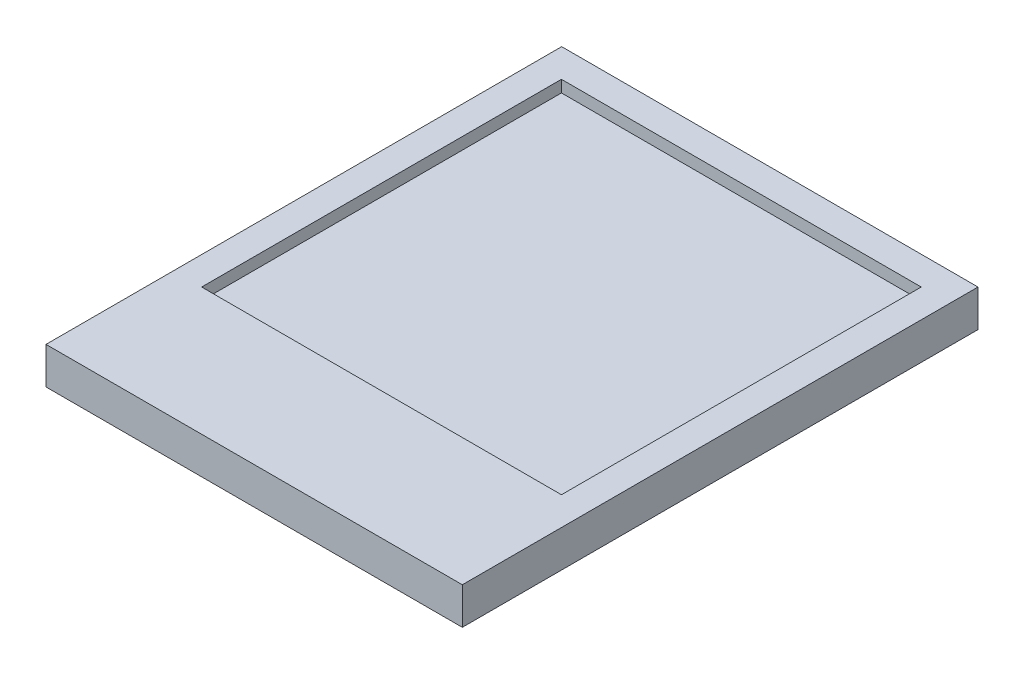
ISO-10303-21;
HEADER;
FILE_DESCRIPTION(('STEP AP214'),'2;1');
FILE_NAME('part.step','',(''),(''),'','','');
FILE_SCHEMA(('AUTOMOTIVE_DESIGN { 1 0 10303 214 1 1 1 1 }'));
ENDSEC;
DATA;
#1=APPLICATION_CONTEXT('core data for automotive mechanical design processes');
#2=APPLICATION_PROTOCOL_DEFINITION('international standard','automotive_design',2000,#1);
#3=PRODUCT_CONTEXT('',#1,'mechanical');
#4=PRODUCT('Part','Part','',(#3));
#5=PRODUCT_RELATED_PRODUCT_CATEGORY('part','',(#4));
#6=PRODUCT_DEFINITION_FORMATION('','',#4);
#7=PRODUCT_DEFINITION_CONTEXT('part definition',#1,'design');
#8=PRODUCT_DEFINITION('design','',#6,#7);
#9=PRODUCT_DEFINITION_SHAPE('','',#8);
#10=(LENGTH_UNIT() NAMED_UNIT(*) SI_UNIT(.MILLI.,.METRE.));
#11=(NAMED_UNIT(*) PLANE_ANGLE_UNIT() SI_UNIT($,.RADIAN.));
#12=(NAMED_UNIT(*) SI_UNIT($,.STERADIAN.) SOLID_ANGLE_UNIT());
#13=UNCERTAINTY_MEASURE_WITH_UNIT(LENGTH_MEASURE(1.E-05),#10,'distance_accuracy_value','');
#14=(GEOMETRIC_REPRESENTATION_CONTEXT(3) GLOBAL_UNCERTAINTY_ASSIGNED_CONTEXT((#13)) GLOBAL_UNIT_ASSIGNED_CONTEXT((#10,
#11,#12)) REPRESENTATION_CONTEXT('',''));
#15=CARTESIAN_POINT('',(0.,0.,0.));
#16=DIRECTION('',(0.,0.,1.));
#17=DIRECTION('',(1.,0.,0.));
#18=AXIS2_PLACEMENT_3D('',#15,#16,#17);
#19=CARTESIAN_POINT('',(-7.82762430939227,1.56,-6.70939226519334));
#20=DIRECTION('',(1.,0.,0.));
#21=DIRECTION('',(0.,0.,-1.));
#22=AXIS2_PLACEMENT_3D('',#19,#20,#21);
#23=PLANE('',#22);
#24=DIRECTION('',(0.,0.,1.));
#25=VECTOR('',#24,1.);
#26=CARTESIAN_POINT('',(-7.82762430939227,0.,-6.70939226519334));
#27=LINE('',#26,#25);
#28=CARTESIAN_POINT('',(-7.82762430939227,0.,-6.70939226519334));
#29=VERTEX_POINT('',#28);
#30=CARTESIAN_POINT('',(-7.82762430939226,0.,15.0906077348067));
#31=VERTEX_POINT('',#30);
#32=EDGE_CURVE('E158',#29,#31,#27,.T.);
#33=ORIENTED_EDGE('',*,*,#32,.T.);
#34=DIRECTION('',(0.,-1.,0.));
#35=VECTOR('',#34,1.);
#36=CARTESIAN_POINT('',(-7.82762430939226,1.56,15.0906077348067));
#37=LINE('',#36,#35);
#38=CARTESIAN_POINT('',(-7.82762430939226,1.56,15.0906077348067));
#39=VERTEX_POINT('',#38);
#40=EDGE_CURVE('E11',#39,#31,#37,.T.);
#41=ORIENTED_EDGE('',*,*,#40,.F.);
#42=DIRECTION('',(0.,0.,1.));
#43=VECTOR('',#42,1.);
#44=CARTESIAN_POINT('',(-7.82762430939227,1.56,-6.70939226519334));
#45=LINE('',#44,#43);
#46=CARTESIAN_POINT('',(-7.82762430939227,1.56,-6.70939226519334));
#47=VERTEX_POINT('',#46);
#48=EDGE_CURVE('E164',#47,#39,#45,.T.);
#49=ORIENTED_EDGE('',*,*,#48,.F.);
#50=DIRECTION('',(0.,-1.,0.));
#51=VECTOR('',#50,1.);
#52=CARTESIAN_POINT('',(-7.82762430939227,1.56,-6.70939226519334));
#53=LINE('',#52,#51);
#54=EDGE_CURVE('E174',#47,#29,#53,.T.);
#55=ORIENTED_EDGE('',*,*,#54,.T.);
#56=EDGE_LOOP('',(#33,#41,#49,#55));
#57=FACE_BOUND('',#56,.T.);
#58=ADVANCED_FACE('F39',(#57),#23,.F.);
#59=CARTESIAN_POINT('',(-7.82762430939226,1.56,15.0906077348067));
#60=DIRECTION('',(0.,0.,-1.));
#61=DIRECTION('',(-1.,0.,0.));
#62=AXIS2_PLACEMENT_3D('',#59,#60,#61);
#63=PLANE('',#62);
#64=DIRECTION('',(1.,0.,0.));
#65=VECTOR('',#64,1.);
#66=CARTESIAN_POINT('',(-7.82762430939226,0.,15.0906077348067));
#67=LINE('',#66,#65);
#68=CARTESIAN_POINT('',(9.77237569060774,0.,15.0906077348067));
#69=VERTEX_POINT('',#68);
#70=EDGE_CURVE('E178',#31,#69,#67,.T.);
#71=ORIENTED_EDGE('',*,*,#70,.T.);
#72=DIRECTION('',(0.,-1.,0.));
#73=VECTOR('',#72,1.);
#74=CARTESIAN_POINT('',(9.77237569060774,1.56,15.0906077348067));
#75=LINE('',#74,#73);
#76=CARTESIAN_POINT('',(9.77237569060774,1.56,15.0906077348067));
#77=VERTEX_POINT('',#76);
#78=EDGE_CURVE('E47',#77,#69,#75,.T.);
#79=ORIENTED_EDGE('',*,*,#78,.F.);
#80=DIRECTION('',(1.,0.,0.));
#81=VECTOR('',#80,1.);
#82=CARTESIAN_POINT('',(-7.82762430939226,1.56,15.0906077348067));
#83=LINE('',#82,#81);
#84=EDGE_CURVE('E91',#39,#77,#83,.T.);
#85=ORIENTED_EDGE('',*,*,#84,.F.);
#86=ORIENTED_EDGE('',*,*,#40,.T.);
#87=EDGE_LOOP('',(#71,#79,#85,#86));
#88=FACE_BOUND('',#87,.T.);
#89=ADVANCED_FACE('F213',(#88),#63,.F.);
#90=CARTESIAN_POINT('',(9.77237569060773,1.56,-6.70939226519334));
#91=DIRECTION('',(-1.,0.,0.));
#92=DIRECTION('',(0.,0.,1.));
#93=AXIS2_PLACEMENT_3D('',#90,#91,#92);
#94=PLANE('',#93);
#95=DIRECTION('',(0.,0.,-1.));
#96=VECTOR('',#95,1.);
#97=CARTESIAN_POINT('',(9.77237569060773,0.,-6.70939226519334));
#98=LINE('',#97,#96);
#99=CARTESIAN_POINT('',(9.77237569060773,0.,-6.70939226519334));
#100=VERTEX_POINT('',#99);
#101=EDGE_CURVE('E181',#69,#100,#98,.T.);
#102=ORIENTED_EDGE('',*,*,#101,.T.);
#103=DIRECTION('',(0.,-1.,0.));
#104=VECTOR('',#103,1.);
#105=CARTESIAN_POINT('',(9.77237569060773,1.56,-6.70939226519334));
#106=LINE('',#105,#104);
#107=CARTESIAN_POINT('',(9.77237569060773,1.56,-6.70939226519334));
#108=VERTEX_POINT('',#107);
#109=EDGE_CURVE('E188',#108,#100,#106,.T.);
#110=ORIENTED_EDGE('',*,*,#109,.F.);
#111=DIRECTION('',(0.,0.,-1.));
#112=VECTOR('',#111,1.);
#113=CARTESIAN_POINT('',(9.77237569060773,1.56,-6.70939226519334));
#114=LINE('',#113,#112);
#115=EDGE_CURVE('E169',#77,#108,#114,.T.);
#116=ORIENTED_EDGE('',*,*,#115,.F.);
#117=ORIENTED_EDGE('',*,*,#78,.T.);
#118=EDGE_LOOP('',(#102,#110,#116,#117));
#119=FACE_BOUND('',#118,.T.);
#120=ADVANCED_FACE('F195',(#119),#94,.F.);
#121=CARTESIAN_POINT('',(-7.82762430939227,1.56,-6.70939226519334));
#122=DIRECTION('',(0.,0.,1.));
#123=DIRECTION('',(1.,0.,0.));
#124=AXIS2_PLACEMENT_3D('',#121,#122,#123);
#125=PLANE('',#124);
#126=DIRECTION('',(-1.,0.,0.));
#127=VECTOR('',#126,1.);
#128=CARTESIAN_POINT('',(-7.82762430939227,0.,-6.70939226519334));
#129=LINE('',#128,#127);
#130=EDGE_CURVE('E84',#100,#29,#129,.T.);
#131=ORIENTED_EDGE('',*,*,#130,.T.);
#132=ORIENTED_EDGE('',*,*,#54,.F.);
#133=DIRECTION('',(-1.,0.,0.));
#134=VECTOR('',#133,1.);
#135=CARTESIAN_POINT('',(-7.82762430939227,1.56,-6.70939226519334));
#136=LINE('',#135,#134);
#137=EDGE_CURVE('E63',#108,#47,#136,.T.);
#138=ORIENTED_EDGE('',*,*,#137,.F.);
#139=ORIENTED_EDGE('',*,*,#109,.T.);
#140=EDGE_LOOP('',(#131,#132,#138,#139));
#141=FACE_BOUND('',#140,.T.);
#142=ADVANCED_FACE('F203',(#141),#125,.F.);
#143=CARTESIAN_POINT('',(0.,1.56,0.));
#144=DIRECTION('',(0.,1.,0.));
#145=DIRECTION('',(0.,0.,1.));
#146=AXIS2_PLACEMENT_3D('',#143,#144,#145);
#147=PLANE('',#146);
#148=DIRECTION('',(0.,0.,1.));
#149=VECTOR('',#148,1.);
#150=CARTESIAN_POINT('',(-6.63762430939226,1.56,-5.50939226519334));
#151=LINE('',#150,#149);
#152=CARTESIAN_POINT('',(-6.63762430939226,1.56,-5.50939226519334));
#153=VERTEX_POINT('',#152);
#154=CARTESIAN_POINT('',(-6.63762430939226,1.56,9.70060773480666));
#155=VERTEX_POINT('',#154);
#156=EDGE_CURVE('E54',#153,#155,#151,.T.);
#157=ORIENTED_EDGE('',*,*,#156,.F.);
#158=DIRECTION('',(-1.,0.,0.));
#159=VECTOR('',#158,1.);
#160=CARTESIAN_POINT('',(-6.63762430939226,1.56,-5.50939226519334));
#161=LINE('',#160,#159);
#162=CARTESIAN_POINT('',(8.57237569060774,1.56,-5.50939226519334));
#163=VERTEX_POINT('',#162);
#164=EDGE_CURVE('E136',#163,#153,#161,.T.);
#165=ORIENTED_EDGE('',*,*,#164,.F.);
#166=DIRECTION('',(0.,0.,-1.));
#167=VECTOR('',#166,1.);
#168=CARTESIAN_POINT('',(8.57237569060774,1.56,-5.50939226519334));
#169=LINE('',#168,#167);
#170=CARTESIAN_POINT('',(8.57237569060774,1.56,9.70060773480666));
#171=VERTEX_POINT('',#170);
#172=EDGE_CURVE('E140',#171,#163,#169,.T.);
#173=ORIENTED_EDGE('',*,*,#172,.F.);
#174=DIRECTION('',(1.,0.,0.));
#175=VECTOR('',#174,1.);
#176=CARTESIAN_POINT('',(-6.63762430939226,1.56,9.70060773480666));
#177=LINE('',#176,#175);
#178=EDGE_CURVE('E149',#155,#171,#177,.T.);
#179=ORIENTED_EDGE('',*,*,#178,.F.);
#180=EDGE_LOOP('',(#157,#165,#173,#179));
#181=FACE_BOUND('',#180,.T.);
#182=ORIENTED_EDGE('',*,*,#48,.T.);
#183=ORIENTED_EDGE('',*,*,#84,.T.);
#184=ORIENTED_EDGE('',*,*,#115,.T.);
#185=ORIENTED_EDGE('',*,*,#137,.T.);
#186=EDGE_LOOP('',(#182,#183,#184,#185));
#187=FACE_BOUND('',#186,.T.);
#188=ADVANCED_FACE('F205',(#181,#187),#147,.T.);
#189=CARTESIAN_POINT('',(0.,0.,0.));
#190=DIRECTION('',(0.,1.,0.));
#191=DIRECTION('',(0.,0.,1.));
#192=AXIS2_PLACEMENT_3D('',#189,#190,#191);
#193=PLANE('',#192);
#194=ORIENTED_EDGE('',*,*,#32,.F.);
#195=ORIENTED_EDGE('',*,*,#130,.F.);
#196=ORIENTED_EDGE('',*,*,#101,.F.);
#197=ORIENTED_EDGE('',*,*,#70,.F.);
#198=EDGE_LOOP('',(#194,#195,#196,#197));
#199=FACE_BOUND('',#198,.T.);
#200=ADVANCED_FACE('F199',(#199),#193,.F.);
#201=CARTESIAN_POINT('',(-6.63762430939226,1.06,-5.50939226519334));
#202=DIRECTION('',(-1.,0.,0.));
#203=DIRECTION('',(0.,0.,1.));
#204=AXIS2_PLACEMENT_3D('',#201,#202,#203);
#205=PLANE('',#204);
#206=ORIENTED_EDGE('',*,*,#156,.T.);
#207=DIRECTION('',(0.,1.,0.));
#208=VECTOR('',#207,1.);
#209=CARTESIAN_POINT('',(-6.63762430939226,1.06,9.70060773480666));
#210=LINE('',#209,#208);
#211=CARTESIAN_POINT('',(-6.63762430939226,1.06,9.70060773480666));
#212=VERTEX_POINT('',#211);
#213=EDGE_CURVE('E111',#212,#155,#210,.T.);
#214=ORIENTED_EDGE('',*,*,#213,.F.);
#215=DIRECTION('',(0.,0.,1.));
#216=VECTOR('',#215,1.);
#217=CARTESIAN_POINT('',(-6.63762430939226,1.06,-5.50939226519334));
#218=LINE('',#217,#216);
#219=CARTESIAN_POINT('',(-6.63762430939226,1.06,-5.50939226519334));
#220=VERTEX_POINT('',#219);
#221=EDGE_CURVE('E115',#220,#212,#218,.T.);
#222=ORIENTED_EDGE('',*,*,#221,.F.);
#223=DIRECTION('',(0.,1.,0.));
#224=VECTOR('',#223,1.);
#225=CARTESIAN_POINT('',(-6.63762430939226,1.06,-5.50939226519334));
#226=LINE('',#225,#224);
#227=EDGE_CURVE('E155',#220,#153,#226,.T.);
#228=ORIENTED_EDGE('',*,*,#227,.T.);
#229=EDGE_LOOP('',(#206,#214,#222,#228));
#230=FACE_BOUND('',#229,.T.);
#231=ADVANCED_FACE('F113',(#230),#205,.F.);
#232=CARTESIAN_POINT('',(-6.63762430939226,1.06,-5.50939226519334));
#233=DIRECTION('',(0.,0.,-1.));
#234=DIRECTION('',(-1.,0.,0.));
#235=AXIS2_PLACEMENT_3D('',#232,#233,#234);
#236=PLANE('',#235);
#237=ORIENTED_EDGE('',*,*,#164,.T.);
#238=ORIENTED_EDGE('',*,*,#227,.F.);
#239=DIRECTION('',(-1.,0.,0.));
#240=VECTOR('',#239,1.);
#241=CARTESIAN_POINT('',(-6.63762430939226,1.06,-5.50939226519334));
#242=LINE('',#241,#240);
#243=CARTESIAN_POINT('',(8.57237569060774,1.06,-5.50939226519334));
#244=VERTEX_POINT('',#243);
#245=EDGE_CURVE('E122',#244,#220,#242,.T.);
#246=ORIENTED_EDGE('',*,*,#245,.F.);
#247=DIRECTION('',(0.,1.,0.));
#248=VECTOR('',#247,1.);
#249=CARTESIAN_POINT('',(8.57237569060774,1.06,-5.50939226519334));
#250=LINE('',#249,#248);
#251=EDGE_CURVE('E159',#244,#163,#250,.T.);
#252=ORIENTED_EDGE('',*,*,#251,.T.);
#253=EDGE_LOOP('',(#237,#238,#246,#252));
#254=FACE_BOUND('',#253,.T.);
#255=ADVANCED_FACE('F252',(#254),#236,.F.);
#256=CARTESIAN_POINT('',(8.57237569060774,1.06,-5.50939226519334));
#257=DIRECTION('',(1.,0.,0.));
#258=DIRECTION('',(0.,0.,-1.));
#259=AXIS2_PLACEMENT_3D('',#256,#257,#258);
#260=PLANE('',#259);
#261=ORIENTED_EDGE('',*,*,#172,.T.);
#262=ORIENTED_EDGE('',*,*,#251,.F.);
#263=DIRECTION('',(0.,0.,-1.));
#264=VECTOR('',#263,1.);
#265=CARTESIAN_POINT('',(8.57237569060774,1.06,-5.50939226519334));
#266=LINE('',#265,#264);
#267=CARTESIAN_POINT('',(8.57237569060774,1.06,9.70060773480666));
#268=VERTEX_POINT('',#267);
#269=EDGE_CURVE('E131',#268,#244,#266,.T.);
#270=ORIENTED_EDGE('',*,*,#269,.F.);
#271=DIRECTION('',(0.,1.,0.));
#272=VECTOR('',#271,1.);
#273=CARTESIAN_POINT('',(8.57237569060774,1.06,9.70060773480666));
#274=LINE('',#273,#272);
#275=EDGE_CURVE('E121',#268,#171,#274,.T.);
#276=ORIENTED_EDGE('',*,*,#275,.T.);
#277=EDGE_LOOP('',(#261,#262,#270,#276));
#278=FACE_BOUND('',#277,.T.);
#279=ADVANCED_FACE('F261',(#278),#260,.F.);
#280=CARTESIAN_POINT('',(-6.63762430939226,1.06,9.70060773480666));
#281=DIRECTION('',(0.,0.,1.));
#282=DIRECTION('',(1.,0.,0.));
#283=AXIS2_PLACEMENT_3D('',#280,#281,#282);
#284=PLANE('',#283);
#285=ORIENTED_EDGE('',*,*,#178,.T.);
#286=ORIENTED_EDGE('',*,*,#275,.F.);
#287=DIRECTION('',(1.,0.,0.));
#288=VECTOR('',#287,1.);
#289=CARTESIAN_POINT('',(-6.63762430939226,1.06,9.70060773480666));
#290=LINE('',#289,#288);
#291=EDGE_CURVE('E125',#212,#268,#290,.T.);
#292=ORIENTED_EDGE('',*,*,#291,.F.);
#293=ORIENTED_EDGE('',*,*,#213,.T.);
#294=EDGE_LOOP('',(#285,#286,#292,#293));
#295=FACE_BOUND('',#294,.T.);
#296=ADVANCED_FACE('F126',(#295),#284,.F.);
#297=CARTESIAN_POINT('',(0.,1.06,0.));
#298=DIRECTION('',(0.,1.,0.));
#299=DIRECTION('',(0.,0.,1.));
#300=AXIS2_PLACEMENT_3D('',#297,#298,#299);
#301=PLANE('',#300);
#302=ORIENTED_EDGE('',*,*,#221,.T.);
#303=ORIENTED_EDGE('',*,*,#291,.T.);
#304=ORIENTED_EDGE('',*,*,#269,.T.);
#305=ORIENTED_EDGE('',*,*,#245,.T.);
#306=EDGE_LOOP('',(#302,#303,#304,#305));
#307=FACE_BOUND('',#306,.T.);
#308=ADVANCED_FACE('F133',(#307),#301,.T.);
#309=CLOSED_SHELL('',(#58,#89,#120,#142,#188,#200,#231,#255,#279,#296,#308));
#310=MANIFOLD_SOLID_BREP('B2',#309);
#311=ADVANCED_BREP_SHAPE_REPRESENTATION('',(#18,#310),#14);
#312=SHAPE_DEFINITION_REPRESENTATION(#9,#311);
ENDSEC;
END-ISO-10303-21;
